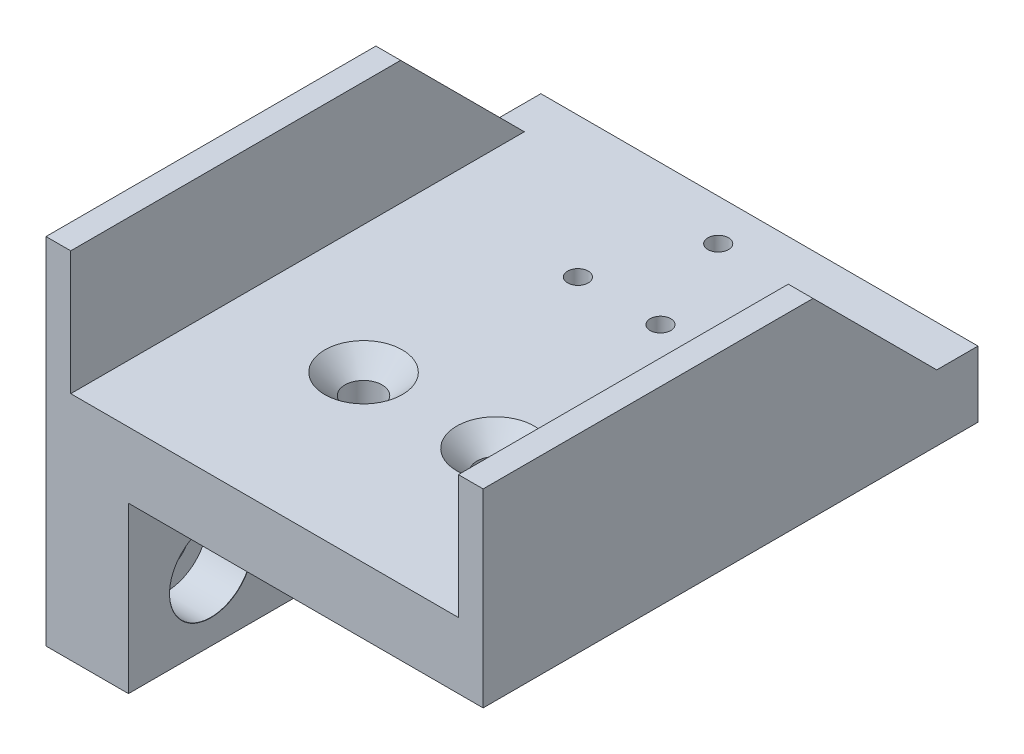
ISO-10303-21;
HEADER;
FILE_DESCRIPTION(('STEP AP214'),'2;1');
FILE_NAME('part.step','',(''),(''),'','','');
FILE_SCHEMA(('AUTOMOTIVE_DESIGN { 1 0 10303 214 1 1 1 1 }'));
ENDSEC;
DATA;
#1=APPLICATION_CONTEXT('core data for automotive mechanical design processes');
#2=APPLICATION_PROTOCOL_DEFINITION('international standard','automotive_design',2000,#1);
#3=PRODUCT_CONTEXT('',#1,'mechanical');
#4=PRODUCT('Part','Part','',(#3));
#5=PRODUCT_RELATED_PRODUCT_CATEGORY('part','',(#4));
#6=PRODUCT_DEFINITION_FORMATION('','',#4);
#7=PRODUCT_DEFINITION_CONTEXT('part definition',#1,'design');
#8=PRODUCT_DEFINITION('design','',#6,#7);
#9=PRODUCT_DEFINITION_SHAPE('','',#8);
#10=(LENGTH_UNIT() NAMED_UNIT(*) SI_UNIT(.MILLI.,.METRE.));
#11=(NAMED_UNIT(*) PLANE_ANGLE_UNIT() SI_UNIT($,.RADIAN.));
#12=(NAMED_UNIT(*) SI_UNIT($,.STERADIAN.) SOLID_ANGLE_UNIT());
#13=UNCERTAINTY_MEASURE_WITH_UNIT(LENGTH_MEASURE(1.E-05),#10,'distance_accuracy_value','');
#14=(GEOMETRIC_REPRESENTATION_CONTEXT(3) GLOBAL_UNCERTAINTY_ASSIGNED_CONTEXT((#13)) GLOBAL_UNIT_ASSIGNED_CONTEXT((#10,
#11,#12)) REPRESENTATION_CONTEXT('',''));
#15=CARTESIAN_POINT('',(0.,0.,0.));
#16=DIRECTION('',(0.,0.,1.));
#17=DIRECTION('',(1.,0.,0.));
#18=AXIS2_PLACEMENT_3D('',#15,#16,#17);
#19=CARTESIAN_POINT('',(-23.5,-3.5,20.));
#20=DIRECTION('',(0.,-1.,0.));
#21=DIRECTION('',(0.,0.,-1.));
#22=AXIS2_PLACEMENT_3D('',#19,#20,#21);
#23=PLANE('',#22);
#24=CARTESIAN_POINT('',(8.,-3.5,0.));
#25=DIRECTION('',(0.,1.,0.));
#26=DIRECTION('',(0.,0.,1.));
#27=AXIS2_PLACEMENT_3D('',#24,#25,#26);
#28=CIRCLE('',#27,4.7);
#29=CARTESIAN_POINT('',(8.,-3.5,4.69999999999999));
#30=VERTEX_POINT('',#29);
#31=EDGE_CURVE('E284',#30,#30,#28,.T.);
#32=ORIENTED_EDGE('',*,*,#31,.F.);
#33=EDGE_LOOP('',(#32));
#34=FACE_BOUND('',#33,.T.);
#35=CARTESIAN_POINT('',(0.,-3.5,-35.));
#36=DIRECTION('',(0.,1.,0.));
#37=DIRECTION('',(0.,0.,1.));
#38=AXIS2_PLACEMENT_3D('',#35,#36,#37);
#39=CIRCLE('',#38,1.25);
#40=CARTESIAN_POINT('',(0.,-3.5,-33.75));
#41=VERTEX_POINT('',#40);
#42=EDGE_CURVE('E275',#41,#41,#39,.T.);
#43=ORIENTED_EDGE('',*,*,#42,.F.);
#44=EDGE_LOOP('',(#43));
#45=FACE_BOUND('',#44,.T.);
#46=DIRECTION('',(0.,0.,1.));
#47=VECTOR('',#46,1.);
#48=CARTESIAN_POINT('',(-26.5,-3.5,-20.));
#49=LINE('',#48,#47);
#50=CARTESIAN_POINT('',(-26.5,-3.5,-40.));
#51=VERTEX_POINT('',#50);
#52=CARTESIAN_POINT('',(-26.5,-3.5,-35.0000000000001));
#53=VERTEX_POINT('',#52);
#54=EDGE_CURVE('E156',#51,#53,#49,.T.);
#55=ORIENTED_EDGE('',*,*,#54,.T.);
#56=DIRECTION('',(1.,0.,0.));
#57=VECTOR('',#56,1.);
#58=CARTESIAN_POINT('',(-23.5,-3.5,-35.0000000000001));
#59=LINE('',#58,#57);
#60=CARTESIAN_POINT('',(-23.5,-3.5,-35.0000000000001));
#61=VERTEX_POINT('',#60);
#62=EDGE_CURVE('E213',#53,#61,#59,.T.);
#63=ORIENTED_EDGE('',*,*,#62,.T.);
#64=DIRECTION('',(0.,0.,-1.));
#65=VECTOR('',#64,1.);
#66=CARTESIAN_POINT('',(-23.5,-3.5,20.));
#67=LINE('',#66,#65);
#68=CARTESIAN_POINT('',(-23.5,-3.5,20.));
#69=VERTEX_POINT('',#68);
#70=EDGE_CURVE('E55',#69,#61,#67,.T.);
#71=ORIENTED_EDGE('',*,*,#70,.F.);
#72=DIRECTION('',(-1.,0.,0.));
#73=VECTOR('',#72,1.);
#74=CARTESIAN_POINT('',(-23.5,-3.5,20.));
#75=LINE('',#74,#73);
#76=CARTESIAN_POINT('',(23.5,-3.5,20.));
#77=VERTEX_POINT('',#76);
#78=EDGE_CURVE('E188',#77,#69,#75,.T.);
#79=ORIENTED_EDGE('',*,*,#78,.F.);
#80=DIRECTION('',(0.,0.,-1.));
#81=VECTOR('',#80,1.);
#82=CARTESIAN_POINT('',(23.5,-3.5,20.));
#83=LINE('',#82,#81);
#84=CARTESIAN_POINT('',(23.5,-3.5,-35.0000000000001));
#85=VERTEX_POINT('',#84);
#86=EDGE_CURVE('E63',#77,#85,#83,.T.);
#87=ORIENTED_EDGE('',*,*,#86,.T.);
#88=DIRECTION('',(1.,0.,0.));
#89=VECTOR('',#88,1.);
#90=CARTESIAN_POINT('',(-23.5,-3.5,-35.0000000000001));
#91=LINE('',#90,#89);
#92=CARTESIAN_POINT('',(26.5,-3.5,-35.0000000000001));
#93=VERTEX_POINT('',#92);
#94=EDGE_CURVE('E211',#85,#93,#91,.T.);
#95=ORIENTED_EDGE('',*,*,#94,.T.);
#96=DIRECTION('',(0.,0.,-1.));
#97=VECTOR('',#96,1.);
#98=CARTESIAN_POINT('',(26.5,-3.5,-20.));
#99=LINE('',#98,#97);
#100=CARTESIAN_POINT('',(26.5,-3.5,-40.));
#101=VERTEX_POINT('',#100);
#102=EDGE_CURVE('E159',#93,#101,#99,.T.);
#103=ORIENTED_EDGE('',*,*,#102,.T.);
#104=DIRECTION('',(-1.,0.,0.));
#105=VECTOR('',#104,1.);
#106=CARTESIAN_POINT('',(-26.5,-3.5,-40.));
#107=LINE('',#106,#105);
#108=EDGE_CURVE('E169',#101,#51,#107,.T.);
#109=ORIENTED_EDGE('',*,*,#108,.T.);
#110=EDGE_LOOP('',(#55,#63,#71,#79,#87,#95,#103,#109));
#111=FACE_BOUND('',#110,.T.);
#112=CARTESIAN_POINT('',(5.,-3.5,-23.));
#113=DIRECTION('',(0.,1.,0.));
#114=DIRECTION('',(0.,0.,1.));
#115=AXIS2_PLACEMENT_3D('',#112,#113,#114);
#116=CIRCLE('',#115,1.25);
#117=CARTESIAN_POINT('',(5.,-3.5,-21.75));
#118=VERTEX_POINT('',#117);
#119=EDGE_CURVE('E259',#118,#118,#116,.T.);
#120=ORIENTED_EDGE('',*,*,#119,.F.);
#121=EDGE_LOOP('',(#120));
#122=FACE_BOUND('',#121,.T.);
#123=CARTESIAN_POINT('',(-5.,-3.5,-23.));
#124=DIRECTION('',(0.,1.,0.));
#125=DIRECTION('',(0.,0.,1.));
#126=AXIS2_PLACEMENT_3D('',#123,#124,#125);
#127=CIRCLE('',#126,1.25);
#128=CARTESIAN_POINT('',(-5.,-3.5,-21.75));
#129=VERTEX_POINT('',#128);
#130=EDGE_CURVE('E269',#129,#129,#127,.T.);
#131=ORIENTED_EDGE('',*,*,#130,.F.);
#132=EDGE_LOOP('',(#131));
#133=FACE_BOUND('',#132,.T.);
#134=CARTESIAN_POINT('',(-8.,-3.5,0.));
#135=DIRECTION('',(0.,1.,0.));
#136=DIRECTION('',(0.,0.,1.));
#137=AXIS2_PLACEMENT_3D('',#134,#135,#136);
#138=CIRCLE('',#137,4.7);
#139=CARTESIAN_POINT('',(-8.,-3.5,4.7));
#140=VERTEX_POINT('',#139);
#141=EDGE_CURVE('E293',#140,#140,#138,.T.);
#142=ORIENTED_EDGE('',*,*,#141,.F.);
#143=EDGE_LOOP('',(#142));
#144=FACE_BOUND('',#143,.T.);
#145=ADVANCED_FACE('F39',(#34,#45,#111,#122,#133,#144),#23,.F.);
#146=CARTESIAN_POINT('',(26.5,-11.5,20.));
#147=DIRECTION('',(0.,1.,0.));
#148=DIRECTION('',(0.,0.,1.));
#149=AXIS2_PLACEMENT_3D('',#146,#147,#148);
#150=PLANE('',#149);
#151=CARTESIAN_POINT('',(-8.,-11.5,0.));
#152=DIRECTION('',(0.,1.,0.));
#153=DIRECTION('',(0.,0.,1.));
#154=AXIS2_PLACEMENT_3D('',#151,#152,#153);
#155=CIRCLE('',#154,2.25);
#156=CARTESIAN_POINT('',(-8.,-11.5,2.25));
#157=VERTEX_POINT('',#156);
#158=EDGE_CURVE('E287',#157,#157,#155,.T.);
#159=ORIENTED_EDGE('',*,*,#158,.T.);
#160=EDGE_LOOP('',(#159));
#161=FACE_BOUND('',#160,.T.);
#162=CARTESIAN_POINT('',(8.,-11.5,0.));
#163=DIRECTION('',(0.,1.,0.));
#164=DIRECTION('',(0.,0.,1.));
#165=AXIS2_PLACEMENT_3D('',#162,#163,#164);
#166=CIRCLE('',#165,2.25);
#167=CARTESIAN_POINT('',(8.,-11.5,2.24999999999999));
#168=VERTEX_POINT('',#167);
#169=EDGE_CURVE('E278',#168,#168,#166,.T.);
#170=ORIENTED_EDGE('',*,*,#169,.T.);
#171=EDGE_LOOP('',(#170));
#172=FACE_BOUND('',#171,.T.);
#173=CARTESIAN_POINT('',(0.,-11.5,-35.));
#174=DIRECTION('',(0.,1.,0.));
#175=DIRECTION('',(0.,0.,1.));
#176=AXIS2_PLACEMENT_3D('',#173,#174,#175);
#177=CIRCLE('',#176,1.25);
#178=CARTESIAN_POINT('',(0.,-11.5,-33.75));
#179=VERTEX_POINT('',#178);
#180=EDGE_CURVE('E272',#179,#179,#177,.T.);
#181=ORIENTED_EDGE('',*,*,#180,.T.);
#182=EDGE_LOOP('',(#181));
#183=FACE_BOUND('',#182,.T.);
#184=CARTESIAN_POINT('',(-5.,-11.5,-23.));
#185=DIRECTION('',(0.,1.,0.));
#186=DIRECTION('',(0.,0.,1.));
#187=AXIS2_PLACEMENT_3D('',#184,#185,#186);
#188=CIRCLE('',#187,1.25);
#189=CARTESIAN_POINT('',(-5.,-11.5,-21.75));
#190=VERTEX_POINT('',#189);
#191=EDGE_CURVE('E266',#190,#190,#188,.T.);
#192=ORIENTED_EDGE('',*,*,#191,.T.);
#193=EDGE_LOOP('',(#192));
#194=FACE_BOUND('',#193,.T.);
#195=CARTESIAN_POINT('',(5.,-11.5,-23.));
#196=DIRECTION('',(0.,1.,0.));
#197=DIRECTION('',(0.,0.,1.));
#198=AXIS2_PLACEMENT_3D('',#195,#196,#197);
#199=CIRCLE('',#198,1.25);
#200=CARTESIAN_POINT('',(5.,-11.5,-21.75));
#201=VERTEX_POINT('',#200);
#202=EDGE_CURVE('E257',#201,#201,#199,.T.);
#203=ORIENTED_EDGE('',*,*,#202,.T.);
#204=EDGE_LOOP('',(#203));
#205=FACE_BOUND('',#204,.T.);
#206=DIRECTION('',(0.,0.,1.));
#207=VECTOR('',#206,1.);
#208=CARTESIAN_POINT('',(-16.5,-11.5,20.));
#209=LINE('',#208,#207);
#210=CARTESIAN_POINT('',(-16.5,-11.5,-40.));
#211=VERTEX_POINT('',#210);
#212=CARTESIAN_POINT('',(-16.5,-11.5,20.));
#213=VERTEX_POINT('',#212);
#214=EDGE_CURVE('E148',#211,#213,#209,.T.);
#215=ORIENTED_EDGE('',*,*,#214,.F.);
#216=DIRECTION('',(1.,0.,0.));
#217=VECTOR('',#216,1.);
#218=CARTESIAN_POINT('',(-26.5,-11.5,-40.));
#219=LINE('',#218,#217);
#220=CARTESIAN_POINT('',(26.5,-11.5,-40.));
#221=VERTEX_POINT('',#220);
#222=EDGE_CURVE('E164',#211,#221,#219,.T.);
#223=ORIENTED_EDGE('',*,*,#222,.T.);
#224=DIRECTION('',(0.,0.,-1.));
#225=VECTOR('',#224,1.);
#226=CARTESIAN_POINT('',(26.5,-11.5,20.));
#227=LINE('',#226,#225);
#228=CARTESIAN_POINT('',(26.5,-11.5,20.));
#229=VERTEX_POINT('',#228);
#230=EDGE_CURVE('E206',#229,#221,#227,.T.);
#231=ORIENTED_EDGE('',*,*,#230,.F.);
#232=DIRECTION('',(1.,0.,0.));
#233=VECTOR('',#232,1.);
#234=CARTESIAN_POINT('',(26.5,-11.5,20.));
#235=LINE('',#234,#233);
#236=EDGE_CURVE('E180',#213,#229,#235,.T.);
#237=ORIENTED_EDGE('',*,*,#236,.F.);
#238=EDGE_LOOP('',(#215,#223,#231,#237));
#239=FACE_BOUND('',#238,.T.);
#240=ADVANCED_FACE('F410',(#161,#172,#183,#194,#205,#239),#150,.F.);
#241=CARTESIAN_POINT('',(-23.5,11.5,20.));
#242=DIRECTION('',(0.,-1.,0.));
#243=DIRECTION('',(0.,0.,-1.));
#244=AXIS2_PLACEMENT_3D('',#241,#242,#243);
#245=PLANE('',#244);
#246=DIRECTION('',(-1.,0.,0.));
#247=VECTOR('',#246,1.);
#248=CARTESIAN_POINT('',(-23.5,11.5,-20.));
#249=LINE('',#248,#247);
#250=CARTESIAN_POINT('',(-23.5,11.5,-20.));
#251=VERTEX_POINT('',#250);
#252=CARTESIAN_POINT('',(-26.5,11.5,-20.));
#253=VERTEX_POINT('',#252);
#254=EDGE_CURVE('E165',#251,#253,#249,.T.);
#255=ORIENTED_EDGE('',*,*,#254,.T.);
#256=DIRECTION('',(0.,0.,-1.));
#257=VECTOR('',#256,1.);
#258=CARTESIAN_POINT('',(-26.5,11.5,20.));
#259=LINE('',#258,#257);
#260=CARTESIAN_POINT('',(-26.5,11.5,20.));
#261=VERTEX_POINT('',#260);
#262=EDGE_CURVE('E209',#261,#253,#259,.T.);
#263=ORIENTED_EDGE('',*,*,#262,.F.);
#264=DIRECTION('',(-1.,0.,0.));
#265=VECTOR('',#264,1.);
#266=CARTESIAN_POINT('',(-23.5,11.5,20.));
#267=LINE('',#266,#265);
#268=CARTESIAN_POINT('',(-23.5,11.5,20.));
#269=VERTEX_POINT('',#268);
#270=EDGE_CURVE('E176',#269,#261,#267,.T.);
#271=ORIENTED_EDGE('',*,*,#270,.F.);
#272=DIRECTION('',(0.,0.,-1.));
#273=VECTOR('',#272,1.);
#274=CARTESIAN_POINT('',(-23.5,11.5,20.));
#275=LINE('',#274,#273);
#276=EDGE_CURVE('E192',#269,#251,#275,.T.);
#277=ORIENTED_EDGE('',*,*,#276,.T.);
#278=EDGE_LOOP('',(#255,#263,#271,#277));
#279=FACE_BOUND('',#278,.T.);
#280=ADVANCED_FACE('F254',(#279),#245,.F.);
#281=CARTESIAN_POINT('',(-26.5,-11.5,20.));
#282=DIRECTION('',(1.,0.,0.));
#283=DIRECTION('',(0.,0.,-1.));
#284=AXIS2_PLACEMENT_3D('',#281,#282,#283);
#285=PLANE('',#284);
#286=CARTESIAN_POINT('',(-26.5,-23.5,-30.));
#287=DIRECTION('',(1.,0.,0.));
#288=DIRECTION('',(0.,0.,-1.));
#289=AXIS2_PLACEMENT_3D('',#286,#287,#288);
#290=CIRCLE('',#289,2.775);
#291=CARTESIAN_POINT('',(-26.5,-23.5,-32.775));
#292=VERTEX_POINT('',#291);
#293=EDGE_CURVE('E347',#292,#292,#290,.T.);
#294=ORIENTED_EDGE('',*,*,#293,.T.);
#295=EDGE_LOOP('',(#294));
#296=FACE_BOUND('',#295,.T.);
#297=CARTESIAN_POINT('',(-26.5,-23.5,-10.));
#298=DIRECTION('',(1.,0.,0.));
#299=DIRECTION('',(0.,0.,-1.));
#300=AXIS2_PLACEMENT_3D('',#297,#298,#299);
#301=CIRCLE('',#300,2.775);
#302=CARTESIAN_POINT('',(-26.5,-23.5,-12.775));
#303=VERTEX_POINT('',#302);
#304=EDGE_CURVE('E329',#303,#303,#301,.T.);
#305=ORIENTED_EDGE('',*,*,#304,.T.);
#306=EDGE_LOOP('',(#305));
#307=FACE_BOUND('',#306,.T.);
#308=CARTESIAN_POINT('',(-26.5,-23.5,10.));
#309=DIRECTION('',(1.,0.,0.));
#310=DIRECTION('',(0.,0.,-1.));
#311=AXIS2_PLACEMENT_3D('',#308,#309,#310);
#312=CIRCLE('',#311,2.775);
#313=CARTESIAN_POINT('',(-26.5,-23.5,7.225));
#314=VERTEX_POINT('',#313);
#315=EDGE_CURVE('E311',#314,#314,#312,.T.);
#316=ORIENTED_EDGE('',*,*,#315,.T.);
#317=EDGE_LOOP('',(#316));
#318=FACE_BOUND('',#317,.T.);
#319=ORIENTED_EDGE('',*,*,#262,.T.);
#320=DIRECTION('',(0.,-0.707106781186544,-0.707106781186551));
#321=VECTOR('',#320,1.);
#322=CARTESIAN_POINT('',(-26.5,20.0000000000001,-11.4999999999998));
#323=LINE('',#322,#321);
#324=EDGE_CURVE('E218',#253,#53,#323,.T.);
#325=ORIENTED_EDGE('',*,*,#324,.T.);
#326=ORIENTED_EDGE('',*,*,#54,.F.);
#327=DIRECTION('',(0.,1.,0.));
#328=VECTOR('',#327,1.);
#329=CARTESIAN_POINT('',(-26.5,-68.1480361530742,-40.));
#330=LINE('',#329,#328);
#331=CARTESIAN_POINT('',(-26.5,-31.5,-40.));
#332=VERTEX_POINT('',#331);
#333=EDGE_CURVE('E166',#332,#51,#330,.T.);
#334=ORIENTED_EDGE('',*,*,#333,.F.);
#335=DIRECTION('',(0.,0.,-1.));
#336=VECTOR('',#335,1.);
#337=CARTESIAN_POINT('',(-26.5,-31.5,20.));
#338=LINE('',#337,#336);
#339=CARTESIAN_POINT('',(-26.5,-31.5,20.));
#340=VERTEX_POINT('',#339);
#341=EDGE_CURVE('E150',#340,#332,#338,.T.);
#342=ORIENTED_EDGE('',*,*,#341,.F.);
#343=DIRECTION('',(0.,-1.,0.));
#344=VECTOR('',#343,1.);
#345=CARTESIAN_POINT('',(-26.5,-11.5,20.));
#346=LINE('',#345,#344);
#347=EDGE_CURVE('E154',#261,#340,#346,.T.);
#348=ORIENTED_EDGE('',*,*,#347,.F.);
#349=EDGE_LOOP('',(#319,#325,#326,#334,#342,#348));
#350=FACE_BOUND('',#349,.T.);
#351=ADVANCED_FACE('F256',(#296,#307,#318,#350),#285,.F.);
#352=CARTESIAN_POINT('',(26.5,-11.5,20.));
#353=DIRECTION('',(-1.,0.,0.));
#354=DIRECTION('',(0.,0.,1.));
#355=AXIS2_PLACEMENT_3D('',#352,#353,#354);
#356=PLANE('',#355);
#357=ORIENTED_EDGE('',*,*,#230,.T.);
#358=DIRECTION('',(0.,1.,0.));
#359=VECTOR('',#358,1.);
#360=CARTESIAN_POINT('',(26.5,-68.1480361530742,-40.));
#361=LINE('',#360,#359);
#362=EDGE_CURVE('E172',#221,#101,#361,.T.);
#363=ORIENTED_EDGE('',*,*,#362,.T.);
#364=ORIENTED_EDGE('',*,*,#102,.F.);
#365=DIRECTION('',(0.,0.707106781186544,0.707106781186551));
#366=VECTOR('',#365,1.);
#367=CARTESIAN_POINT('',(26.5,20.0000000000001,-11.4999999999998));
#368=LINE('',#367,#366);
#369=CARTESIAN_POINT('',(26.5,11.5,-20.));
#370=VERTEX_POINT('',#369);
#371=EDGE_CURVE('E48',#93,#370,#368,.T.);
#372=ORIENTED_EDGE('',*,*,#371,.T.);
#373=DIRECTION('',(0.,0.,-1.));
#374=VECTOR('',#373,1.);
#375=CARTESIAN_POINT('',(26.5,11.5,20.));
#376=LINE('',#375,#374);
#377=CARTESIAN_POINT('',(26.5,11.5,20.));
#378=VERTEX_POINT('',#377);
#379=EDGE_CURVE('E203',#378,#370,#376,.T.);
#380=ORIENTED_EDGE('',*,*,#379,.F.);
#381=DIRECTION('',(0.,1.,0.));
#382=VECTOR('',#381,1.);
#383=CARTESIAN_POINT('',(26.5,-11.5,20.));
#384=LINE('',#383,#382);
#385=EDGE_CURVE('E182',#229,#378,#384,.T.);
#386=ORIENTED_EDGE('',*,*,#385,.F.);
#387=EDGE_LOOP('',(#357,#363,#364,#372,#380,#386));
#388=FACE_BOUND('',#387,.T.);
#389=ADVANCED_FACE('F222',(#388),#356,.F.);
#390=CARTESIAN_POINT('',(26.5,11.5,20.));
#391=DIRECTION('',(0.,-1.,0.));
#392=DIRECTION('',(0.,0.,-1.));
#393=AXIS2_PLACEMENT_3D('',#390,#391,#392);
#394=PLANE('',#393);
#395=DIRECTION('',(-1.,0.,0.));
#396=VECTOR('',#395,1.);
#397=CARTESIAN_POINT('',(26.5,11.5,-20.));
#398=LINE('',#397,#396);
#399=CARTESIAN_POINT('',(23.5,11.5,-20.));
#400=VERTEX_POINT('',#399);
#401=EDGE_CURVE('E178',#370,#400,#398,.T.);
#402=ORIENTED_EDGE('',*,*,#401,.T.);
#403=DIRECTION('',(0.,0.,-1.));
#404=VECTOR('',#403,1.);
#405=CARTESIAN_POINT('',(23.5,11.5,20.));
#406=LINE('',#405,#404);
#407=CARTESIAN_POINT('',(23.5,11.5,20.));
#408=VERTEX_POINT('',#407);
#409=EDGE_CURVE('E200',#408,#400,#406,.T.);
#410=ORIENTED_EDGE('',*,*,#409,.F.);
#411=DIRECTION('',(-1.,0.,0.));
#412=VECTOR('',#411,1.);
#413=CARTESIAN_POINT('',(26.5,11.5,20.));
#414=LINE('',#413,#412);
#415=EDGE_CURVE('E184',#378,#408,#414,.T.);
#416=ORIENTED_EDGE('',*,*,#415,.F.);
#417=ORIENTED_EDGE('',*,*,#379,.T.);
#418=EDGE_LOOP('',(#402,#410,#416,#417));
#419=FACE_BOUND('',#418,.T.);
#420=ADVANCED_FACE('F229',(#419),#394,.F.);
#421=CARTESIAN_POINT('',(23.5,11.5,20.));
#422=DIRECTION('',(1.,0.,0.));
#423=DIRECTION('',(0.,0.,-1.));
#424=AXIS2_PLACEMENT_3D('',#421,#422,#423);
#425=PLANE('',#424);
#426=ORIENTED_EDGE('',*,*,#409,.T.);
#427=DIRECTION('',(0.,-0.707106781186544,-0.707106781186551));
#428=VECTOR('',#427,1.);
#429=CARTESIAN_POINT('',(23.5,31.5,2.32452945780892E-13));
#430=LINE('',#429,#428);
#431=EDGE_CURVE('E11',#400,#85,#430,.T.);
#432=ORIENTED_EDGE('',*,*,#431,.T.);
#433=ORIENTED_EDGE('',*,*,#86,.F.);
#434=DIRECTION('',(0.,-1.,0.));
#435=VECTOR('',#434,1.);
#436=CARTESIAN_POINT('',(23.5,11.5,20.));
#437=LINE('',#436,#435);
#438=EDGE_CURVE('E186',#408,#77,#437,.T.);
#439=ORIENTED_EDGE('',*,*,#438,.F.);
#440=EDGE_LOOP('',(#426,#432,#433,#439));
#441=FACE_BOUND('',#440,.T.);
#442=ADVANCED_FACE('F233',(#441),#425,.F.);
#443=CARTESIAN_POINT('',(-23.5,11.5,20.));
#444=DIRECTION('',(-1.,0.,0.));
#445=DIRECTION('',(0.,0.,1.));
#446=AXIS2_PLACEMENT_3D('',#443,#444,#445);
#447=PLANE('',#446);
#448=ORIENTED_EDGE('',*,*,#70,.T.);
#449=DIRECTION('',(0.,0.707106781186544,0.707106781186551));
#450=VECTOR('',#449,1.);
#451=CARTESIAN_POINT('',(-23.5,31.5,2.32452945780892E-13));
#452=LINE('',#451,#450);
#453=EDGE_CURVE('E216',#61,#251,#452,.T.);
#454=ORIENTED_EDGE('',*,*,#453,.T.);
#455=ORIENTED_EDGE('',*,*,#276,.F.);
#456=DIRECTION('',(0.,1.,0.));
#457=VECTOR('',#456,1.);
#458=CARTESIAN_POINT('',(-23.5,11.5,20.));
#459=LINE('',#458,#457);
#460=EDGE_CURVE('E190',#69,#269,#459,.T.);
#461=ORIENTED_EDGE('',*,*,#460,.F.);
#462=EDGE_LOOP('',(#448,#454,#455,#461));
#463=FACE_BOUND('',#462,.T.);
#464=ADVANCED_FACE('F251',(#463),#447,.F.);
#465=CARTESIAN_POINT('',(0.,0.,20.));
#466=DIRECTION('',(0.,0.,-1.));
#467=DIRECTION('',(-1.,0.,0.));
#468=AXIS2_PLACEMENT_3D('',#465,#466,#467);
#469=PLANE('',#468);
#470=ORIENTED_EDGE('',*,*,#270,.T.);
#471=ORIENTED_EDGE('',*,*,#347,.T.);
#472=DIRECTION('',(-1.,0.,0.));
#473=VECTOR('',#472,1.);
#474=CARTESIAN_POINT('',(-16.5,-31.5,20.));
#475=LINE('',#474,#473);
#476=CARTESIAN_POINT('',(-16.5,-31.5,20.));
#477=VERTEX_POINT('',#476);
#478=EDGE_CURVE('E136',#477,#340,#475,.T.);
#479=ORIENTED_EDGE('',*,*,#478,.F.);
#480=DIRECTION('',(0.,-1.,0.));
#481=VECTOR('',#480,1.);
#482=CARTESIAN_POINT('',(-16.5,-11.5,20.));
#483=LINE('',#482,#481);
#484=EDGE_CURVE('E143',#213,#477,#483,.T.);
#485=ORIENTED_EDGE('',*,*,#484,.F.);
#486=ORIENTED_EDGE('',*,*,#236,.T.);
#487=ORIENTED_EDGE('',*,*,#385,.T.);
#488=ORIENTED_EDGE('',*,*,#415,.T.);
#489=ORIENTED_EDGE('',*,*,#438,.T.);
#490=ORIENTED_EDGE('',*,*,#78,.T.);
#491=ORIENTED_EDGE('',*,*,#460,.T.);
#492=EDGE_LOOP('',(#470,#471,#479,#485,#486,#487,#488,#489,#490,#491));
#493=FACE_BOUND('',#492,.T.);
#494=ADVANCED_FACE('F153',(#493),#469,.F.);
#495=CARTESIAN_POINT('',(-26.5,-68.1480361530742,-40.));
#496=DIRECTION('',(0.,0.,-1.));
#497=DIRECTION('',(-1.,0.,0.));
#498=AXIS2_PLACEMENT_3D('',#495,#496,#497);
#499=PLANE('',#498);
#500=ORIENTED_EDGE('',*,*,#222,.F.);
#501=DIRECTION('',(0.,1.,0.));
#502=VECTOR('',#501,1.);
#503=CARTESIAN_POINT('',(-16.5,-11.5,-40.));
#504=LINE('',#503,#502);
#505=CARTESIAN_POINT('',(-16.5,-31.5,-40.));
#506=VERTEX_POINT('',#505);
#507=EDGE_CURVE('E142',#506,#211,#504,.T.);
#508=ORIENTED_EDGE('',*,*,#507,.F.);
#509=DIRECTION('',(-1.,0.,0.));
#510=VECTOR('',#509,1.);
#511=CARTESIAN_POINT('',(-16.5,-31.5,-40.));
#512=LINE('',#511,#510);
#513=EDGE_CURVE('E138',#506,#332,#512,.T.);
#514=ORIENTED_EDGE('',*,*,#513,.T.);
#515=ORIENTED_EDGE('',*,*,#333,.T.);
#516=ORIENTED_EDGE('',*,*,#108,.F.);
#517=ORIENTED_EDGE('',*,*,#362,.F.);
#518=EDGE_LOOP('',(#500,#508,#514,#515,#516,#517));
#519=FACE_BOUND('',#518,.T.);
#520=ADVANCED_FACE('F241',(#519),#499,.T.);
#521=CARTESIAN_POINT('',(-16.5,-31.5,20.));
#522=DIRECTION('',(0.,1.,0.));
#523=DIRECTION('',(0.,0.,1.));
#524=AXIS2_PLACEMENT_3D('',#521,#522,#523);
#525=PLANE('',#524);
#526=ORIENTED_EDGE('',*,*,#341,.T.);
#527=ORIENTED_EDGE('',*,*,#513,.F.);
#528=DIRECTION('',(0.,0.,-1.));
#529=VECTOR('',#528,1.);
#530=CARTESIAN_POINT('',(-16.5,-31.5,20.));
#531=LINE('',#530,#529);
#532=EDGE_CURVE('E131',#477,#506,#531,.T.);
#533=ORIENTED_EDGE('',*,*,#532,.F.);
#534=ORIENTED_EDGE('',*,*,#478,.T.);
#535=EDGE_LOOP('',(#526,#527,#533,#534));
#536=FACE_BOUND('',#535,.T.);
#537=ADVANCED_FACE('F134',(#536),#525,.F.);
#538=CARTESIAN_POINT('',(-16.5,0.,0.));
#539=DIRECTION('',(1.,0.,0.));
#540=DIRECTION('',(0.,0.,-1.));
#541=AXIS2_PLACEMENT_3D('',#538,#539,#540);
#542=PLANE('',#541);
#543=CARTESIAN_POINT('',(-16.5,-23.5,-30.));
#544=DIRECTION('',(1.,0.,0.));
#545=DIRECTION('',(0.,0.,-1.));
#546=AXIS2_PLACEMENT_3D('',#543,#544,#545);
#547=CIRCLE('',#546,5.025);
#548=CARTESIAN_POINT('',(-16.5,-23.5,-35.025));
#549=VERTEX_POINT('',#548);
#550=EDGE_CURVE('E344',#549,#549,#547,.T.);
#551=ORIENTED_EDGE('',*,*,#550,.F.);
#552=EDGE_LOOP('',(#551));
#553=FACE_BOUND('',#552,.T.);
#554=CARTESIAN_POINT('',(-16.5,-23.5,-10.));
#555=DIRECTION('',(1.,0.,0.));
#556=DIRECTION('',(0.,0.,-1.));
#557=AXIS2_PLACEMENT_3D('',#554,#555,#556);
#558=CIRCLE('',#557,5.025);
#559=CARTESIAN_POINT('',(-16.5,-23.5,-15.025));
#560=VERTEX_POINT('',#559);
#561=EDGE_CURVE('E326',#560,#560,#558,.T.);
#562=ORIENTED_EDGE('',*,*,#561,.F.);
#563=EDGE_LOOP('',(#562));
#564=FACE_BOUND('',#563,.T.);
#565=CARTESIAN_POINT('',(-16.5,-23.5,10.));
#566=DIRECTION('',(1.,0.,0.));
#567=DIRECTION('',(0.,0.,-1.));
#568=AXIS2_PLACEMENT_3D('',#565,#566,#567);
#569=CIRCLE('',#568,5.025);
#570=CARTESIAN_POINT('',(-16.5,-23.5,4.975));
#571=VERTEX_POINT('',#570);
#572=EDGE_CURVE('E308',#571,#571,#569,.T.);
#573=ORIENTED_EDGE('',*,*,#572,.F.);
#574=EDGE_LOOP('',(#573));
#575=FACE_BOUND('',#574,.T.);
#576=ORIENTED_EDGE('',*,*,#484,.T.);
#577=ORIENTED_EDGE('',*,*,#532,.T.);
#578=ORIENTED_EDGE('',*,*,#507,.T.);
#579=ORIENTED_EDGE('',*,*,#214,.T.);
#580=EDGE_LOOP('',(#576,#577,#578,#579));
#581=FACE_BOUND('',#580,.T.);
#582=ADVANCED_FACE('F147',(#553,#564,#575,#581),#542,.T.);
#583=CARTESIAN_POINT('',(5.,-3.5,-23.));
#584=DIRECTION('',(0.,1.,0.));
#585=DIRECTION('',(0.,0.,1.));
#586=AXIS2_PLACEMENT_3D('',#583,#584,#585);
#587=CYLINDRICAL_SURFACE('',#586,1.25);
#588=ORIENTED_EDGE('',*,*,#202,.F.);
#589=EDGE_LOOP('',(#588));
#590=FACE_BOUND('',#589,.T.);
#591=ORIENTED_EDGE('',*,*,#119,.T.);
#592=EDGE_LOOP('',(#591));
#593=FACE_BOUND('',#592,.T.);
#594=ADVANCED_FACE('F386',(#590,#593),#587,.F.);
#595=CARTESIAN_POINT('',(-5.,-3.5,-23.));
#596=DIRECTION('',(0.,1.,0.));
#597=DIRECTION('',(0.,0.,1.));
#598=AXIS2_PLACEMENT_3D('',#595,#596,#597);
#599=CYLINDRICAL_SURFACE('',#598,1.25);
#600=ORIENTED_EDGE('',*,*,#191,.F.);
#601=EDGE_LOOP('',(#600));
#602=FACE_BOUND('',#601,.T.);
#603=ORIENTED_EDGE('',*,*,#130,.T.);
#604=EDGE_LOOP('',(#603));
#605=FACE_BOUND('',#604,.T.);
#606=ADVANCED_FACE('F466',(#602,#605),#599,.F.);
#607=CARTESIAN_POINT('',(0.,-3.5,-35.));
#608=DIRECTION('',(0.,1.,0.));
#609=DIRECTION('',(0.,0.,1.));
#610=AXIS2_PLACEMENT_3D('',#607,#608,#609);
#611=CYLINDRICAL_SURFACE('',#610,1.25);
#612=ORIENTED_EDGE('',*,*,#180,.F.);
#613=EDGE_LOOP('',(#612));
#614=FACE_BOUND('',#613,.T.);
#615=ORIENTED_EDGE('',*,*,#42,.T.);
#616=EDGE_LOOP('',(#615));
#617=FACE_BOUND('',#616,.T.);
#618=ADVANCED_FACE('F462',(#614,#617),#611,.F.);
#619=CARTESIAN_POINT('',(8.,-3.5,0.));
#620=DIRECTION('',(0.,1.,0.));
#621=DIRECTION('',(0.,0.,1.));
#622=AXIS2_PLACEMENT_3D('',#619,#620,#621);
#623=CYLINDRICAL_SURFACE('',#622,2.25);
#624=ORIENTED_EDGE('',*,*,#169,.F.);
#625=EDGE_LOOP('',(#624));
#626=FACE_BOUND('',#625,.T.);
#627=CARTESIAN_POINT('',(8.,-5.95,0.));
#628=DIRECTION('',(0.,1.,0.));
#629=DIRECTION('',(0.,0.,1.));
#630=AXIS2_PLACEMENT_3D('',#627,#628,#629);
#631=CIRCLE('',#630,2.25);
#632=CARTESIAN_POINT('',(8.,-5.95,2.24999999999999));
#633=VERTEX_POINT('',#632);
#634=EDGE_CURVE('E281',#633,#633,#631,.T.);
#635=ORIENTED_EDGE('',*,*,#634,.T.);
#636=EDGE_LOOP('',(#635));
#637=FACE_BOUND('',#636,.T.);
#638=ADVANCED_FACE('F458',(#626,#637),#623,.F.);
#639=CARTESIAN_POINT('',(8.,-3.5,0.));
#640=DIRECTION('',(0.,1.,0.));
#641=DIRECTION('',(0.,0.,1.));
#642=AXIS2_PLACEMENT_3D('',#639,#640,#641);
#643=CONICAL_SURFACE('',#642,4.7,0.785398163397448);
#644=ORIENTED_EDGE('',*,*,#634,.F.);
#645=EDGE_LOOP('',(#644));
#646=FACE_BOUND('',#645,.T.);
#647=ORIENTED_EDGE('',*,*,#31,.T.);
#648=EDGE_LOOP('',(#647));
#649=FACE_BOUND('',#648,.T.);
#650=ADVANCED_FACE('F448',(#646,#649),#643,.F.);
#651=CARTESIAN_POINT('',(-8.,-3.5,0.));
#652=DIRECTION('',(0.,1.,0.));
#653=DIRECTION('',(0.,0.,1.));
#654=AXIS2_PLACEMENT_3D('',#651,#652,#653);
#655=CYLINDRICAL_SURFACE('',#654,2.25);
#656=ORIENTED_EDGE('',*,*,#158,.F.);
#657=EDGE_LOOP('',(#656));
#658=FACE_BOUND('',#657,.T.);
#659=CARTESIAN_POINT('',(-8.,-5.95,0.));
#660=DIRECTION('',(0.,1.,0.));
#661=DIRECTION('',(0.,0.,1.));
#662=AXIS2_PLACEMENT_3D('',#659,#660,#661);
#663=CIRCLE('',#662,2.25);
#664=CARTESIAN_POINT('',(-8.,-5.95,2.25));
#665=VERTEX_POINT('',#664);
#666=EDGE_CURVE('E290',#665,#665,#663,.T.);
#667=ORIENTED_EDGE('',*,*,#666,.T.);
#668=EDGE_LOOP('',(#667));
#669=FACE_BOUND('',#668,.T.);
#670=ADVANCED_FACE('F442',(#658,#669),#655,.F.);
#671=CARTESIAN_POINT('',(-8.,-3.5,0.));
#672=DIRECTION('',(0.,1.,0.));
#673=DIRECTION('',(0.,0.,1.));
#674=AXIS2_PLACEMENT_3D('',#671,#672,#673);
#675=CONICAL_SURFACE('',#674,4.7,0.785398163397449);
#676=ORIENTED_EDGE('',*,*,#666,.F.);
#677=EDGE_LOOP('',(#676));
#678=FACE_BOUND('',#677,.T.);
#679=ORIENTED_EDGE('',*,*,#141,.T.);
#680=EDGE_LOOP('',(#679));
#681=FACE_BOUND('',#680,.T.);
#682=ADVANCED_FACE('F436',(#678,#681),#675,.F.);
#683=CARTESIAN_POINT('',(-23.5,-3.5,-35.0000000000001));
#684=DIRECTION('',(0.,-0.707106781186551,0.707106781186544));
#685=DIRECTION('',(1.,0.,0.));
#686=AXIS2_PLACEMENT_3D('',#683,#684,#685);
#687=PLANE('',#686);
#688=ORIENTED_EDGE('',*,*,#324,.F.);
#689=ORIENTED_EDGE('',*,*,#254,.F.);
#690=ORIENTED_EDGE('',*,*,#453,.F.);
#691=ORIENTED_EDGE('',*,*,#62,.F.);
#692=EDGE_LOOP('',(#688,#689,#690,#691));
#693=FACE_BOUND('',#692,.T.);
#694=ADVANCED_FACE('F248',(#693),#687,.F.);
#695=CARTESIAN_POINT('',(-23.5,-3.5,-35.0000000000001));
#696=DIRECTION('',(0.,-0.707106781186551,0.707106781186544));
#697=DIRECTION('',(1.,0.,0.));
#698=AXIS2_PLACEMENT_3D('',#695,#696,#697);
#699=PLANE('',#698);
#700=ORIENTED_EDGE('',*,*,#431,.F.);
#701=ORIENTED_EDGE('',*,*,#401,.F.);
#702=ORIENTED_EDGE('',*,*,#371,.F.);
#703=ORIENTED_EDGE('',*,*,#94,.F.);
#704=EDGE_LOOP('',(#700,#701,#702,#703));
#705=FACE_BOUND('',#704,.T.);
#706=ADVANCED_FACE('F42',(#705),#699,.F.);
#707=CARTESIAN_POINT('',(-26.475,-23.5,10.));
#708=DIRECTION('',(-1.,0.,0.));
#709=DIRECTION('',(0.,0.,1.));
#710=AXIS2_PLACEMENT_3D('',#707,#708,#709);
#711=CONICAL_SURFACE('',#710,2.75,0.785398163397518);
#712=ORIENTED_EDGE('',*,*,#315,.F.);
#713=EDGE_LOOP('',(#712));
#714=FACE_BOUND('',#713,.T.);
#715=CARTESIAN_POINT('',(-26.475,-23.5,10.));
#716=DIRECTION('',(1.,0.,0.));
#717=DIRECTION('',(0.,0.,-1.));
#718=AXIS2_PLACEMENT_3D('',#715,#716,#717);
#719=CIRCLE('',#718,2.75);
#720=CARTESIAN_POINT('',(-26.475,-23.5,7.25));
#721=VERTEX_POINT('',#720);
#722=EDGE_CURVE('E296',#721,#721,#719,.T.);
#723=ORIENTED_EDGE('',*,*,#722,.T.);
#724=EDGE_LOOP('',(#723));
#725=FACE_BOUND('',#724,.T.);
#726=ADVANCED_FACE('F441',(#714,#725),#711,.F.);
#727=CARTESIAN_POINT('',(-16.5,-23.5,10.));
#728=DIRECTION('',(1.,0.,0.));
#729=DIRECTION('',(0.,0.,-1.));
#730=AXIS2_PLACEMENT_3D('',#727,#728,#729);
#731=CYLINDRICAL_SURFACE('',#730,2.75);
#732=ORIENTED_EDGE('',*,*,#722,.F.);
#733=EDGE_LOOP('',(#732));
#734=FACE_BOUND('',#733,.T.);
#735=CARTESIAN_POINT('',(-21.9,-23.5,10.));
#736=DIRECTION('',(1.,0.,0.));
#737=DIRECTION('',(0.,0.,-1.));
#738=AXIS2_PLACEMENT_3D('',#735,#736,#737);
#739=CIRCLE('',#738,2.75);
#740=CARTESIAN_POINT('',(-21.9,-23.5,7.25));
#741=VERTEX_POINT('',#740);
#742=EDGE_CURVE('E299',#741,#741,#739,.T.);
#743=ORIENTED_EDGE('',*,*,#742,.T.);
#744=EDGE_LOOP('',(#743));
#745=FACE_BOUND('',#744,.T.);
#746=ADVANCED_FACE('F574',(#734,#745),#731,.F.);
#747=CARTESIAN_POINT('',(-21.9,-18.5,10.));
#748=DIRECTION('',(-1.,0.,0.));
#749=DIRECTION('',(0.,0.,1.));
#750=AXIS2_PLACEMENT_3D('',#747,#748,#749);
#751=PLANE('',#750);
#752=ORIENTED_EDGE('',*,*,#742,.F.);
#753=EDGE_LOOP('',(#752));
#754=FACE_BOUND('',#753,.T.);
#755=CARTESIAN_POINT('',(-21.9,-23.5,10.));
#756=DIRECTION('',(1.,0.,0.));
#757=DIRECTION('',(0.,0.,-1.));
#758=AXIS2_PLACEMENT_3D('',#755,#756,#757);
#759=CIRCLE('',#758,5.);
#760=CARTESIAN_POINT('',(-21.9,-23.5,5.));
#761=VERTEX_POINT('',#760);
#762=EDGE_CURVE('E302',#761,#761,#759,.T.);
#763=ORIENTED_EDGE('',*,*,#762,.T.);
#764=EDGE_LOOP('',(#763));
#765=FACE_BOUND('',#764,.T.);
#766=ADVANCED_FACE('F405',(#754,#765),#751,.F.);
#767=CARTESIAN_POINT('',(-16.5,-23.5,10.));
#768=DIRECTION('',(1.,0.,0.));
#769=DIRECTION('',(0.,0.,-1.));
#770=AXIS2_PLACEMENT_3D('',#767,#768,#769);
#771=CYLINDRICAL_SURFACE('',#770,5.);
#772=ORIENTED_EDGE('',*,*,#762,.F.);
#773=EDGE_LOOP('',(#772));
#774=FACE_BOUND('',#773,.T.);
#775=CARTESIAN_POINT('',(-16.525,-23.5,10.));
#776=DIRECTION('',(1.,0.,0.));
#777=DIRECTION('',(0.,0.,-1.));
#778=AXIS2_PLACEMENT_3D('',#775,#776,#777);
#779=CIRCLE('',#778,5.);
#780=CARTESIAN_POINT('',(-16.525,-23.5,5.));
#781=VERTEX_POINT('',#780);
#782=EDGE_CURVE('E305',#781,#781,#779,.T.);
#783=ORIENTED_EDGE('',*,*,#782,.T.);
#784=EDGE_LOOP('',(#783));
#785=FACE_BOUND('',#784,.T.);
#786=ADVANCED_FACE('F395',(#774,#785),#771,.F.);
#787=CARTESIAN_POINT('',(-16.5,-23.5,10.));
#788=DIRECTION('',(1.,0.,0.));
#789=DIRECTION('',(0.,0.,-1.));
#790=AXIS2_PLACEMENT_3D('',#787,#788,#789);
#791=CONICAL_SURFACE('',#790,5.025,0.785398163397448);
#792=ORIENTED_EDGE('',*,*,#782,.F.);
#793=EDGE_LOOP('',(#792));
#794=FACE_BOUND('',#793,.T.);
#795=ORIENTED_EDGE('',*,*,#572,.T.);
#796=EDGE_LOOP('',(#795));
#797=FACE_BOUND('',#796,.T.);
#798=ADVANCED_FACE('F392',(#794,#797),#791,.F.);
#799=CARTESIAN_POINT('',(-26.475,-23.5,-10.));
#800=DIRECTION('',(-1.,0.,0.));
#801=DIRECTION('',(0.,0.,1.));
#802=AXIS2_PLACEMENT_3D('',#799,#800,#801);
#803=CONICAL_SURFACE('',#802,2.75,0.785398163397518);
#804=ORIENTED_EDGE('',*,*,#304,.F.);
#805=EDGE_LOOP('',(#804));
#806=FACE_BOUND('',#805,.T.);
#807=CARTESIAN_POINT('',(-26.475,-23.5,-10.));
#808=DIRECTION('',(1.,0.,0.));
#809=DIRECTION('',(0.,0.,-1.));
#810=AXIS2_PLACEMENT_3D('',#807,#808,#809);
#811=CIRCLE('',#810,2.75);
#812=CARTESIAN_POINT('',(-26.475,-23.5,-12.75));
#813=VERTEX_POINT('',#812);
#814=EDGE_CURVE('E314',#813,#813,#811,.T.);
#815=ORIENTED_EDGE('',*,*,#814,.T.);
#816=EDGE_LOOP('',(#815));
#817=FACE_BOUND('',#816,.T.);
#818=ADVANCED_FACE('F394',(#806,#817),#803,.F.);
#819=CARTESIAN_POINT('',(-16.5,-23.5,-10.));
#820=DIRECTION('',(1.,0.,0.));
#821=DIRECTION('',(0.,0.,-1.));
#822=AXIS2_PLACEMENT_3D('',#819,#820,#821);
#823=CYLINDRICAL_SURFACE('',#822,2.75);
#824=ORIENTED_EDGE('',*,*,#814,.F.);
#825=EDGE_LOOP('',(#824));
#826=FACE_BOUND('',#825,.T.);
#827=CARTESIAN_POINT('',(-21.9,-23.5,-10.));
#828=DIRECTION('',(1.,0.,0.));
#829=DIRECTION('',(0.,0.,-1.));
#830=AXIS2_PLACEMENT_3D('',#827,#828,#829);
#831=CIRCLE('',#830,2.75);
#832=CARTESIAN_POINT('',(-21.9,-23.5,-12.75));
#833=VERTEX_POINT('',#832);
#834=EDGE_CURVE('E317',#833,#833,#831,.T.);
#835=ORIENTED_EDGE('',*,*,#834,.T.);
#836=EDGE_LOOP('',(#835));
#837=FACE_BOUND('',#836,.T.);
#838=ADVANCED_FACE('F402',(#826,#837),#823,.F.);
#839=CARTESIAN_POINT('',(-21.9,-18.5,-10.));
#840=DIRECTION('',(-1.,0.,0.));
#841=DIRECTION('',(0.,0.,1.));
#842=AXIS2_PLACEMENT_3D('',#839,#840,#841);
#843=PLANE('',#842);
#844=ORIENTED_EDGE('',*,*,#834,.F.);
#845=EDGE_LOOP('',(#844));
#846=FACE_BOUND('',#845,.T.);
#847=CARTESIAN_POINT('',(-21.9,-23.5,-10.));
#848=DIRECTION('',(1.,0.,0.));
#849=DIRECTION('',(0.,0.,-1.));
#850=AXIS2_PLACEMENT_3D('',#847,#848,#849);
#851=CIRCLE('',#850,5.);
#852=CARTESIAN_POINT('',(-21.9,-23.5,-15.));
#853=VERTEX_POINT('',#852);
#854=EDGE_CURVE('E320',#853,#853,#851,.T.);
#855=ORIENTED_EDGE('',*,*,#854,.T.);
#856=EDGE_LOOP('',(#855));
#857=FACE_BOUND('',#856,.T.);
#858=ADVANCED_FACE('F617',(#846,#857),#843,.F.);
#859=CARTESIAN_POINT('',(-16.5,-23.5,-10.));
#860=DIRECTION('',(1.,0.,0.));
#861=DIRECTION('',(0.,0.,-1.));
#862=AXIS2_PLACEMENT_3D('',#859,#860,#861);
#863=CYLINDRICAL_SURFACE('',#862,5.);
#864=ORIENTED_EDGE('',*,*,#854,.F.);
#865=EDGE_LOOP('',(#864));
#866=FACE_BOUND('',#865,.T.);
#867=CARTESIAN_POINT('',(-16.525,-23.5,-10.));
#868=DIRECTION('',(1.,0.,0.));
#869=DIRECTION('',(0.,0.,-1.));
#870=AXIS2_PLACEMENT_3D('',#867,#868,#869);
#871=CIRCLE('',#870,5.);
#872=CARTESIAN_POINT('',(-16.525,-23.5,-15.));
#873=VERTEX_POINT('',#872);
#874=EDGE_CURVE('E323',#873,#873,#871,.T.);
#875=ORIENTED_EDGE('',*,*,#874,.T.);
#876=EDGE_LOOP('',(#875));
#877=FACE_BOUND('',#876,.T.);
#878=ADVANCED_FACE('F627',(#866,#877),#863,.F.);
#879=CARTESIAN_POINT('',(-16.5,-23.5,-10.));
#880=DIRECTION('',(1.,0.,0.));
#881=DIRECTION('',(0.,0.,-1.));
#882=AXIS2_PLACEMENT_3D('',#879,#880,#881);
#883=CONICAL_SURFACE('',#882,5.025,0.785398163397448);
#884=ORIENTED_EDGE('',*,*,#874,.F.);
#885=EDGE_LOOP('',(#884));
#886=FACE_BOUND('',#885,.T.);
#887=ORIENTED_EDGE('',*,*,#561,.T.);
#888=EDGE_LOOP('',(#887));
#889=FACE_BOUND('',#888,.T.);
#890=ADVANCED_FACE('F357',(#886,#889),#883,.F.);
#891=CARTESIAN_POINT('',(-26.475,-23.5,-30.));
#892=DIRECTION('',(-1.,0.,0.));
#893=DIRECTION('',(0.,0.,1.));
#894=AXIS2_PLACEMENT_3D('',#891,#892,#893);
#895=CONICAL_SURFACE('',#894,2.75,0.785398163397518);
#896=ORIENTED_EDGE('',*,*,#293,.F.);
#897=EDGE_LOOP('',(#896));
#898=FACE_BOUND('',#897,.T.);
#899=CARTESIAN_POINT('',(-26.475,-23.5,-30.));
#900=DIRECTION('',(1.,0.,0.));
#901=DIRECTION('',(0.,0.,-1.));
#902=AXIS2_PLACEMENT_3D('',#899,#900,#901);
#903=CIRCLE('',#902,2.75);
#904=CARTESIAN_POINT('',(-26.475,-23.5,-32.75));
#905=VERTEX_POINT('',#904);
#906=EDGE_CURVE('E332',#905,#905,#903,.T.);
#907=ORIENTED_EDGE('',*,*,#906,.T.);
#908=EDGE_LOOP('',(#907));
#909=FACE_BOUND('',#908,.T.);
#910=ADVANCED_FACE('F353',(#898,#909),#895,.F.);
#911=CARTESIAN_POINT('',(-16.5,-23.5,-30.));
#912=DIRECTION('',(1.,0.,0.));
#913=DIRECTION('',(0.,0.,-1.));
#914=AXIS2_PLACEMENT_3D('',#911,#912,#913);
#915=CYLINDRICAL_SURFACE('',#914,2.75);
#916=ORIENTED_EDGE('',*,*,#906,.F.);
#917=EDGE_LOOP('',(#916));
#918=FACE_BOUND('',#917,.T.);
#919=CARTESIAN_POINT('',(-21.9,-23.5,-30.));
#920=DIRECTION('',(1.,0.,0.));
#921=DIRECTION('',(0.,0.,-1.));
#922=AXIS2_PLACEMENT_3D('',#919,#920,#921);
#923=CIRCLE('',#922,2.75);
#924=CARTESIAN_POINT('',(-21.9,-23.5,-32.75));
#925=VERTEX_POINT('',#924);
#926=EDGE_CURVE('E335',#925,#925,#923,.T.);
#927=ORIENTED_EDGE('',*,*,#926,.T.);
#928=EDGE_LOOP('',(#927));
#929=FACE_BOUND('',#928,.T.);
#930=ADVANCED_FACE('F356',(#918,#929),#915,.F.);
#931=CARTESIAN_POINT('',(-21.9,-18.5,-30.));
#932=DIRECTION('',(-1.,0.,0.));
#933=DIRECTION('',(0.,0.,1.));
#934=AXIS2_PLACEMENT_3D('',#931,#932,#933);
#935=PLANE('',#934);
#936=ORIENTED_EDGE('',*,*,#926,.F.);
#937=EDGE_LOOP('',(#936));
#938=FACE_BOUND('',#937,.T.);
#939=CARTESIAN_POINT('',(-21.9,-23.5,-30.));
#940=DIRECTION('',(1.,0.,0.));
#941=DIRECTION('',(0.,0.,-1.));
#942=AXIS2_PLACEMENT_3D('',#939,#940,#941);
#943=CIRCLE('',#942,5.);
#944=CARTESIAN_POINT('',(-21.9,-23.5,-35.));
#945=VERTEX_POINT('',#944);
#946=EDGE_CURVE('E338',#945,#945,#943,.T.);
#947=ORIENTED_EDGE('',*,*,#946,.T.);
#948=EDGE_LOOP('',(#947));
#949=FACE_BOUND('',#948,.T.);
#950=ADVANCED_FACE('F363',(#938,#949),#935,.F.);
#951=CARTESIAN_POINT('',(-16.5,-23.5,-30.));
#952=DIRECTION('',(1.,0.,0.));
#953=DIRECTION('',(0.,0.,-1.));
#954=AXIS2_PLACEMENT_3D('',#951,#952,#953);
#955=CYLINDRICAL_SURFACE('',#954,5.);
#956=ORIENTED_EDGE('',*,*,#946,.F.);
#957=EDGE_LOOP('',(#956));
#958=FACE_BOUND('',#957,.T.);
#959=CARTESIAN_POINT('',(-16.525,-23.5,-30.));
#960=DIRECTION('',(1.,0.,0.));
#961=DIRECTION('',(0.,0.,-1.));
#962=AXIS2_PLACEMENT_3D('',#959,#960,#961);
#963=CIRCLE('',#962,5.);
#964=CARTESIAN_POINT('',(-16.525,-23.5,-35.));
#965=VERTEX_POINT('',#964);
#966=EDGE_CURVE('E341',#965,#965,#963,.T.);
#967=ORIENTED_EDGE('',*,*,#966,.T.);
#968=EDGE_LOOP('',(#967));
#969=FACE_BOUND('',#968,.T.);
#970=ADVANCED_FACE('F369',(#958,#969),#955,.F.);
#971=CARTESIAN_POINT('',(-16.5,-23.5,-30.));
#972=DIRECTION('',(1.,0.,0.));
#973=DIRECTION('',(0.,0.,-1.));
#974=AXIS2_PLACEMENT_3D('',#971,#972,#973);
#975=CONICAL_SURFACE('',#974,5.025,0.785398163397448);
#976=ORIENTED_EDGE('',*,*,#966,.F.);
#977=EDGE_LOOP('',(#976));
#978=FACE_BOUND('',#977,.T.);
#979=ORIENTED_EDGE('',*,*,#550,.T.);
#980=EDGE_LOOP('',(#979));
#981=FACE_BOUND('',#980,.T.);
#982=ADVANCED_FACE('F375',(#978,#981),#975,.F.);
#983=CLOSED_SHELL('',(#145,#240,#280,#351,#389,#420,#442,#464,#494,#520,#537,#582,#594,#606,
#618,#638,#650,#670,#682,#694,#706,#726,#746,#766,#786,#798,#818,#838,#858,#878,#890,#910,#930,
#950,#970,#982));
#984=MANIFOLD_SOLID_BREP('B2',#983);
#985=ADVANCED_BREP_SHAPE_REPRESENTATION('',(#18,#984),#14);
#986=SHAPE_DEFINITION_REPRESENTATION(#9,#985);
ENDSEC;
END-ISO-10303-21;
